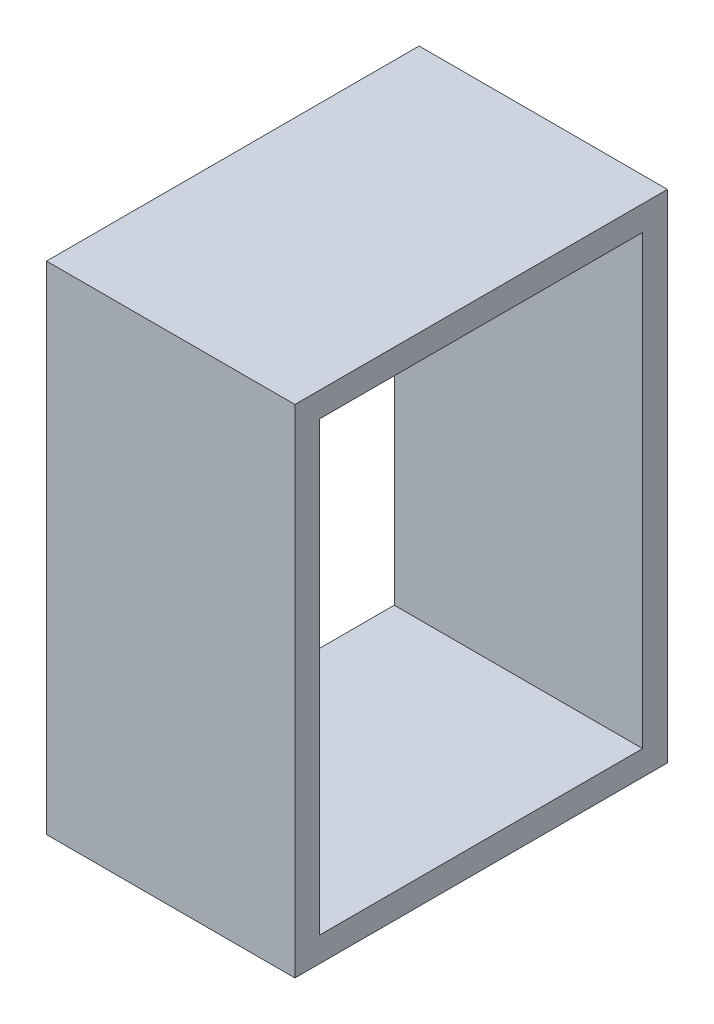
ISO-10303-21;
HEADER;
FILE_DESCRIPTION(('STEP AP214'),'2;1');
FILE_NAME('part.step','',(''),(''),'','','');
FILE_SCHEMA(('AUTOMOTIVE_DESIGN { 1 0 10303 214 1 1 1 1 }'));
ENDSEC;
DATA;
#1=APPLICATION_CONTEXT('core data for automotive mechanical design processes');
#2=APPLICATION_PROTOCOL_DEFINITION('international standard','automotive_design',2000,#1);
#3=PRODUCT_CONTEXT('',#1,'mechanical');
#4=PRODUCT('Part','Part','',(#3));
#5=PRODUCT_RELATED_PRODUCT_CATEGORY('part','',(#4));
#6=PRODUCT_DEFINITION_FORMATION('','',#4);
#7=PRODUCT_DEFINITION_CONTEXT('part definition',#1,'design');
#8=PRODUCT_DEFINITION('design','',#6,#7);
#9=PRODUCT_DEFINITION_SHAPE('','',#8);
#10=(LENGTH_UNIT() NAMED_UNIT(*) SI_UNIT(.MILLI.,.METRE.));
#11=(NAMED_UNIT(*) PLANE_ANGLE_UNIT() SI_UNIT($,.RADIAN.));
#12=(NAMED_UNIT(*) SI_UNIT($,.STERADIAN.) SOLID_ANGLE_UNIT());
#13=UNCERTAINTY_MEASURE_WITH_UNIT(LENGTH_MEASURE(1.E-05),#10,'distance_accuracy_value','');
#14=(GEOMETRIC_REPRESENTATION_CONTEXT(3) GLOBAL_UNCERTAINTY_ASSIGNED_CONTEXT((#13)) GLOBAL_UNIT_ASSIGNED_CONTEXT((#10,
#11,#12)) REPRESENTATION_CONTEXT('',''));
#15=CARTESIAN_POINT('',(0.,0.,0.));
#16=DIRECTION('',(0.,0.,1.));
#17=DIRECTION('',(1.,0.,0.));
#18=AXIS2_PLACEMENT_3D('',#15,#16,#17);
#19=CARTESIAN_POINT('',(100.,0.,0.));
#20=DIRECTION('',(-1.,0.,0.));
#21=DIRECTION('',(0.,0.,1.));
#22=AXIS2_PLACEMENT_3D('',#19,#20,#21);
#23=PLANE('',#22);
#24=DIRECTION('',(0.,-1.,0.));
#25=VECTOR('',#24,1.);
#26=CARTESIAN_POINT('',(100.,0.,0.));
#27=LINE('',#26,#25);
#28=CARTESIAN_POINT('',(100.,200.,0.));
#29=VERTEX_POINT('',#28);
#30=CARTESIAN_POINT('',(100.,0.,0.));
#31=VERTEX_POINT('',#30);
#32=EDGE_CURVE('E138',#29,#31,#27,.T.);
#33=ORIENTED_EDGE('',*,*,#32,.T.);
#34=DIRECTION('',(0.,0.,-1.));
#35=VECTOR('',#34,1.);
#36=CARTESIAN_POINT('',(100.,0.,0.));
#37=LINE('',#36,#35);
#38=CARTESIAN_POINT('',(100.,0.,-150.));
#39=VERTEX_POINT('',#38);
#40=EDGE_CURVE('E141',#31,#39,#37,.T.);
#41=ORIENTED_EDGE('',*,*,#40,.T.);
#42=DIRECTION('',(0.,1.,0.));
#43=VECTOR('',#42,1.);
#44=CARTESIAN_POINT('',(100.,0.,-150.));
#45=LINE('',#44,#43);
#46=CARTESIAN_POINT('',(100.,200.,-150.));
#47=VERTEX_POINT('',#46);
#48=EDGE_CURVE('E144',#39,#47,#45,.T.);
#49=ORIENTED_EDGE('',*,*,#48,.T.);
#50=DIRECTION('',(0.,0.,1.));
#51=VECTOR('',#50,1.);
#52=CARTESIAN_POINT('',(100.,200.,0.));
#53=LINE('',#52,#51);
#54=EDGE_CURVE('E146',#47,#29,#53,.T.);
#55=ORIENTED_EDGE('',*,*,#54,.T.);
#56=EDGE_LOOP('',(#33,#41,#49,#55));
#57=FACE_BOUND('',#56,.T.);
#58=DIRECTION('',(0.,-1.,0.));
#59=VECTOR('',#58,1.);
#60=CARTESIAN_POINT('',(100.,10.,-10.));
#61=LINE('',#60,#59);
#62=CARTESIAN_POINT('',(100.,190.,-10.));
#63=VERTEX_POINT('',#62);
#64=CARTESIAN_POINT('',(100.,10.,-10.));
#65=VERTEX_POINT('',#64);
#66=EDGE_CURVE('E102',#63,#65,#61,.T.);
#67=ORIENTED_EDGE('',*,*,#66,.F.);
#68=DIRECTION('',(0.,0.,1.));
#69=VECTOR('',#68,1.);
#70=CARTESIAN_POINT('',(100.,190.,-10.));
#71=LINE('',#70,#69);
#72=CARTESIAN_POINT('',(100.,190.,-140.));
#73=VERTEX_POINT('',#72);
#74=EDGE_CURVE('E124',#73,#63,#71,.T.);
#75=ORIENTED_EDGE('',*,*,#74,.F.);
#76=DIRECTION('',(0.,1.,0.));
#77=VECTOR('',#76,1.);
#78=CARTESIAN_POINT('',(100.,10.,-140.));
#79=LINE('',#78,#77);
#80=CARTESIAN_POINT('',(100.,10.,-140.));
#81=VERTEX_POINT('',#80);
#82=EDGE_CURVE('E122',#81,#73,#79,.T.);
#83=ORIENTED_EDGE('',*,*,#82,.F.);
#84=DIRECTION('',(0.,0.,-1.));
#85=VECTOR('',#84,1.);
#86=CARTESIAN_POINT('',(100.,10.,-10.));
#87=LINE('',#86,#85);
#88=EDGE_CURVE('E110',#65,#81,#87,.T.);
#89=ORIENTED_EDGE('',*,*,#88,.F.);
#90=EDGE_LOOP('',(#67,#75,#83,#89));
#91=FACE_BOUND('',#90,.T.);
#92=ADVANCED_FACE('F37',(#57,#91),#23,.F.);
#93=CARTESIAN_POINT('',(0.,0.,0.));
#94=DIRECTION('',(-1.,0.,0.));
#95=DIRECTION('',(0.,0.,1.));
#96=AXIS2_PLACEMENT_3D('',#93,#94,#95);
#97=PLANE('',#96);
#98=DIRECTION('',(0.,-1.,0.));
#99=VECTOR('',#98,1.);
#100=CARTESIAN_POINT('',(0.,0.,0.));
#101=LINE('',#100,#99);
#102=CARTESIAN_POINT('',(0.,200.,0.));
#103=VERTEX_POINT('',#102);
#104=CARTESIAN_POINT('',(0.,0.,0.));
#105=VERTEX_POINT('',#104);
#106=EDGE_CURVE('E118',#103,#105,#101,.T.);
#107=ORIENTED_EDGE('',*,*,#106,.F.);
#108=DIRECTION('',(0.,0.,1.));
#109=VECTOR('',#108,1.);
#110=CARTESIAN_POINT('',(0.,200.,0.));
#111=LINE('',#110,#109);
#112=CARTESIAN_POINT('',(0.,200.,-150.));
#113=VERTEX_POINT('',#112);
#114=EDGE_CURVE('E142',#113,#103,#111,.T.);
#115=ORIENTED_EDGE('',*,*,#114,.F.);
#116=DIRECTION('',(0.,1.,0.));
#117=VECTOR('',#116,1.);
#118=CARTESIAN_POINT('',(0.,0.,-150.));
#119=LINE('',#118,#117);
#120=CARTESIAN_POINT('',(0.,0.,-150.));
#121=VERTEX_POINT('',#120);
#122=EDGE_CURVE('E153',#121,#113,#119,.T.);
#123=ORIENTED_EDGE('',*,*,#122,.F.);
#124=DIRECTION('',(0.,0.,-1.));
#125=VECTOR('',#124,1.);
#126=CARTESIAN_POINT('',(0.,0.,0.));
#127=LINE('',#126,#125);
#128=EDGE_CURVE('E151',#105,#121,#127,.T.);
#129=ORIENTED_EDGE('',*,*,#128,.F.);
#130=EDGE_LOOP('',(#107,#115,#123,#129));
#131=FACE_BOUND('',#130,.T.);
#132=DIRECTION('',(0.,0.,1.));
#133=VECTOR('',#132,1.);
#134=CARTESIAN_POINT('',(0.,190.,-10.));
#135=LINE('',#134,#133);
#136=CARTESIAN_POINT('',(0.,190.,-140.));
#137=VERTEX_POINT('',#136);
#138=CARTESIAN_POINT('',(0.,190.,-10.));
#139=VERTEX_POINT('',#138);
#140=EDGE_CURVE('E111',#137,#139,#135,.T.);
#141=ORIENTED_EDGE('',*,*,#140,.T.);
#142=DIRECTION('',(0.,-1.,0.));
#143=VECTOR('',#142,1.);
#144=CARTESIAN_POINT('',(0.,10.,-10.));
#145=LINE('',#144,#143);
#146=CARTESIAN_POINT('',(0.,10.,-10.));
#147=VERTEX_POINT('',#146);
#148=EDGE_CURVE('E60',#139,#147,#145,.T.);
#149=ORIENTED_EDGE('',*,*,#148,.T.);
#150=DIRECTION('',(0.,0.,-1.));
#151=VECTOR('',#150,1.);
#152=CARTESIAN_POINT('',(0.,10.,-10.));
#153=LINE('',#152,#151);
#154=CARTESIAN_POINT('',(0.,10.,-140.));
#155=VERTEX_POINT('',#154);
#156=EDGE_CURVE('E117',#147,#155,#153,.T.);
#157=ORIENTED_EDGE('',*,*,#156,.T.);
#158=DIRECTION('',(0.,1.,0.));
#159=VECTOR('',#158,1.);
#160=CARTESIAN_POINT('',(0.,10.,-140.));
#161=LINE('',#160,#159);
#162=EDGE_CURVE('E130',#155,#137,#161,.T.);
#163=ORIENTED_EDGE('',*,*,#162,.T.);
#164=EDGE_LOOP('',(#141,#149,#157,#163));
#165=FACE_BOUND('',#164,.T.);
#166=ADVANCED_FACE('F171',(#131,#165),#97,.T.);
#167=CARTESIAN_POINT('',(100.,0.,0.));
#168=DIRECTION('',(0.,0.,-1.));
#169=DIRECTION('',(-1.,0.,0.));
#170=AXIS2_PLACEMENT_3D('',#167,#168,#169);
#171=PLANE('',#170);
#172=ORIENTED_EDGE('',*,*,#106,.T.);
#173=DIRECTION('',(-1.,0.,0.));
#174=VECTOR('',#173,1.);
#175=CARTESIAN_POINT('',(100.,0.,0.));
#176=LINE('',#175,#174);
#177=EDGE_CURVE('E11',#31,#105,#176,.T.);
#178=ORIENTED_EDGE('',*,*,#177,.F.);
#179=ORIENTED_EDGE('',*,*,#32,.F.);
#180=DIRECTION('',(-1.,0.,0.));
#181=VECTOR('',#180,1.);
#182=CARTESIAN_POINT('',(100.,200.,0.));
#183=LINE('',#182,#181);
#184=EDGE_CURVE('E148',#29,#103,#183,.T.);
#185=ORIENTED_EDGE('',*,*,#184,.T.);
#186=EDGE_LOOP('',(#172,#178,#179,#185));
#187=FACE_BOUND('',#186,.T.);
#188=ADVANCED_FACE('F39',(#187),#171,.F.);
#189=CARTESIAN_POINT('',(100.,0.,0.));
#190=DIRECTION('',(0.,1.,0.));
#191=DIRECTION('',(0.,0.,1.));
#192=AXIS2_PLACEMENT_3D('',#189,#190,#191);
#193=PLANE('',#192);
#194=ORIENTED_EDGE('',*,*,#128,.T.);
#195=DIRECTION('',(-1.,0.,0.));
#196=VECTOR('',#195,1.);
#197=CARTESIAN_POINT('',(100.,0.,-150.));
#198=LINE('',#197,#196);
#199=EDGE_CURVE('E45',#39,#121,#198,.T.);
#200=ORIENTED_EDGE('',*,*,#199,.F.);
#201=ORIENTED_EDGE('',*,*,#40,.F.);
#202=ORIENTED_EDGE('',*,*,#177,.T.);
#203=EDGE_LOOP('',(#194,#200,#201,#202));
#204=FACE_BOUND('',#203,.T.);
#205=ADVANCED_FACE('F181',(#204),#193,.F.);
#206=CARTESIAN_POINT('',(100.,0.,-150.));
#207=DIRECTION('',(0.,0.,1.));
#208=DIRECTION('',(1.,0.,0.));
#209=AXIS2_PLACEMENT_3D('',#206,#207,#208);
#210=PLANE('',#209);
#211=ORIENTED_EDGE('',*,*,#122,.T.);
#212=DIRECTION('',(-1.,0.,0.));
#213=VECTOR('',#212,1.);
#214=CARTESIAN_POINT('',(100.,200.,-150.));
#215=LINE('',#214,#213);
#216=EDGE_CURVE('E158',#47,#113,#215,.T.);
#217=ORIENTED_EDGE('',*,*,#216,.F.);
#218=ORIENTED_EDGE('',*,*,#48,.F.);
#219=ORIENTED_EDGE('',*,*,#199,.T.);
#220=EDGE_LOOP('',(#211,#217,#218,#219));
#221=FACE_BOUND('',#220,.T.);
#222=ADVANCED_FACE('F165',(#221),#210,.F.);
#223=CARTESIAN_POINT('',(100.,200.,0.));
#224=DIRECTION('',(0.,-1.,0.));
#225=DIRECTION('',(0.,0.,-1.));
#226=AXIS2_PLACEMENT_3D('',#223,#224,#225);
#227=PLANE('',#226);
#228=ORIENTED_EDGE('',*,*,#114,.T.);
#229=ORIENTED_EDGE('',*,*,#184,.F.);
#230=ORIENTED_EDGE('',*,*,#54,.F.);
#231=ORIENTED_EDGE('',*,*,#216,.T.);
#232=EDGE_LOOP('',(#228,#229,#230,#231));
#233=FACE_BOUND('',#232,.T.);
#234=ADVANCED_FACE('F175',(#233),#227,.F.);
#235=CARTESIAN_POINT('',(100.,10.,-10.));
#236=DIRECTION('',(0.,0.,-1.));
#237=DIRECTION('',(-1.,0.,0.));
#238=AXIS2_PLACEMENT_3D('',#235,#236,#237);
#239=PLANE('',#238);
#240=ORIENTED_EDGE('',*,*,#148,.F.);
#241=DIRECTION('',(-1.,0.,0.));
#242=VECTOR('',#241,1.);
#243=CARTESIAN_POINT('',(100.,190.,-10.));
#244=LINE('',#243,#242);
#245=EDGE_CURVE('E106',#63,#139,#244,.T.);
#246=ORIENTED_EDGE('',*,*,#245,.F.);
#247=ORIENTED_EDGE('',*,*,#66,.T.);
#248=DIRECTION('',(-1.,0.,0.));
#249=VECTOR('',#248,1.);
#250=CARTESIAN_POINT('',(100.,10.,-10.));
#251=LINE('',#250,#249);
#252=EDGE_CURVE('E105',#65,#147,#251,.T.);
#253=ORIENTED_EDGE('',*,*,#252,.T.);
#254=EDGE_LOOP('',(#240,#246,#247,#253));
#255=FACE_BOUND('',#254,.T.);
#256=ADVANCED_FACE('F104',(#255),#239,.T.);
#257=CARTESIAN_POINT('',(100.,10.,-10.));
#258=DIRECTION('',(0.,1.,0.));
#259=DIRECTION('',(0.,0.,1.));
#260=AXIS2_PLACEMENT_3D('',#257,#258,#259);
#261=PLANE('',#260);
#262=ORIENTED_EDGE('',*,*,#156,.F.);
#263=ORIENTED_EDGE('',*,*,#252,.F.);
#264=ORIENTED_EDGE('',*,*,#88,.T.);
#265=DIRECTION('',(-1.,0.,0.));
#266=VECTOR('',#265,1.);
#267=CARTESIAN_POINT('',(100.,10.,-140.));
#268=LINE('',#267,#266);
#269=EDGE_CURVE('E119',#81,#155,#268,.T.);
#270=ORIENTED_EDGE('',*,*,#269,.T.);
#271=EDGE_LOOP('',(#262,#263,#264,#270));
#272=FACE_BOUND('',#271,.T.);
#273=ADVANCED_FACE('F114',(#272),#261,.T.);
#274=CARTESIAN_POINT('',(100.,10.,-140.));
#275=DIRECTION('',(0.,0.,1.));
#276=DIRECTION('',(1.,0.,0.));
#277=AXIS2_PLACEMENT_3D('',#274,#275,#276);
#278=PLANE('',#277);
#279=ORIENTED_EDGE('',*,*,#162,.F.);
#280=ORIENTED_EDGE('',*,*,#269,.F.);
#281=ORIENTED_EDGE('',*,*,#82,.T.);
#282=DIRECTION('',(-1.,0.,0.));
#283=VECTOR('',#282,1.);
#284=CARTESIAN_POINT('',(100.,190.,-140.));
#285=LINE('',#284,#283);
#286=EDGE_CURVE('E52',#73,#137,#285,.T.);
#287=ORIENTED_EDGE('',*,*,#286,.T.);
#288=EDGE_LOOP('',(#279,#280,#281,#287));
#289=FACE_BOUND('',#288,.T.);
#290=ADVANCED_FACE('F204',(#289),#278,.T.);
#291=CARTESIAN_POINT('',(100.,190.,-10.));
#292=DIRECTION('',(0.,-1.,0.));
#293=DIRECTION('',(0.,0.,-1.));
#294=AXIS2_PLACEMENT_3D('',#291,#292,#293);
#295=PLANE('',#294);
#296=ORIENTED_EDGE('',*,*,#140,.F.);
#297=ORIENTED_EDGE('',*,*,#286,.F.);
#298=ORIENTED_EDGE('',*,*,#74,.T.);
#299=ORIENTED_EDGE('',*,*,#245,.T.);
#300=EDGE_LOOP('',(#296,#297,#298,#299));
#301=FACE_BOUND('',#300,.T.);
#302=ADVANCED_FACE('F208',(#301),#295,.T.);
#303=CLOSED_SHELL('',(#92,#166,#188,#205,#222,#234,#256,#273,#290,#302));
#304=MANIFOLD_SOLID_BREP('B2',#303);
#305=ADVANCED_BREP_SHAPE_REPRESENTATION('',(#18,#304),#14);
#306=SHAPE_DEFINITION_REPRESENTATION(#9,#305);
ENDSEC;
END-ISO-10303-21;
